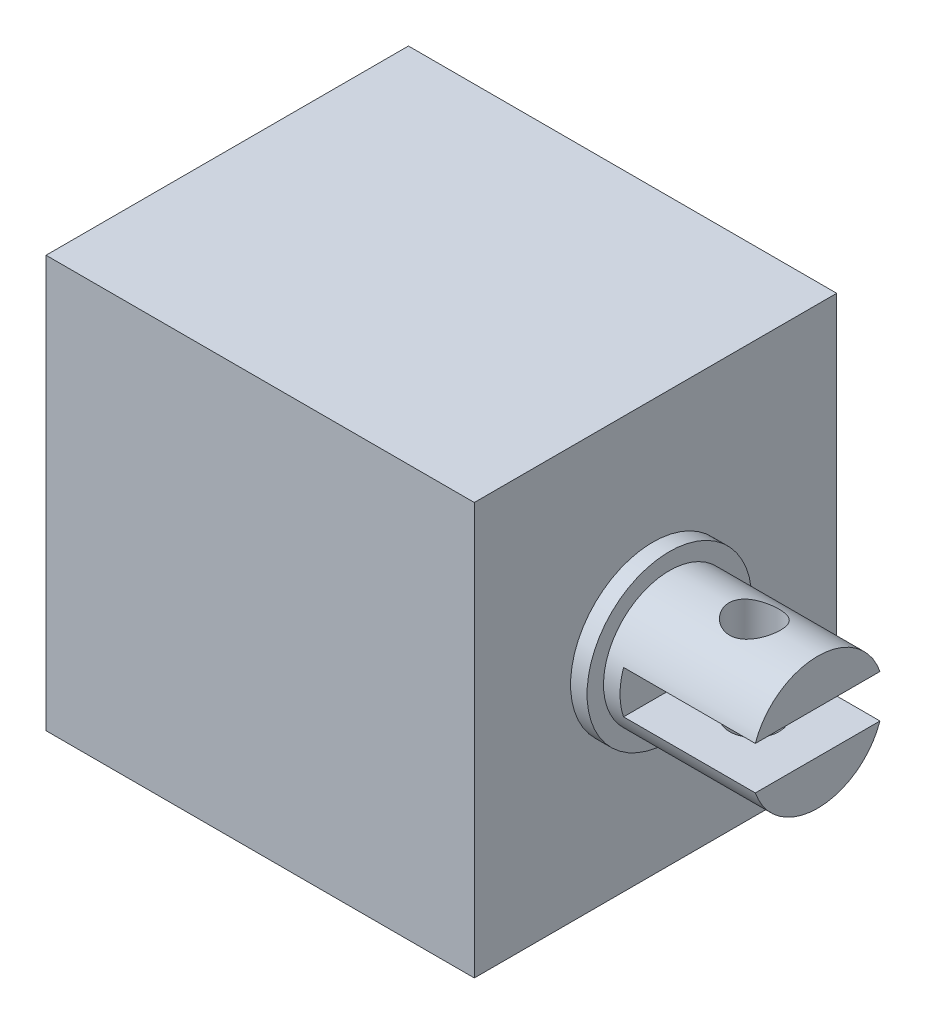
ISO-10303-21;
HEADER;
FILE_DESCRIPTION(('STEP AP214'),'2;1');
FILE_NAME('part.step','',(''),(''),'','','');
FILE_SCHEMA(('AUTOMOTIVE_DESIGN { 1 0 10303 214 1 1 1 1 }'));
ENDSEC;
DATA;
#1=APPLICATION_CONTEXT('core data for automotive mechanical design processes');
#2=APPLICATION_PROTOCOL_DEFINITION('international standard','automotive_design',2000,#1);
#3=PRODUCT_CONTEXT('',#1,'mechanical');
#4=PRODUCT('Part','Part','',(#3));
#5=PRODUCT_RELATED_PRODUCT_CATEGORY('part','',(#4));
#6=PRODUCT_DEFINITION_FORMATION('','',#4);
#7=PRODUCT_DEFINITION_CONTEXT('part definition',#1,'design');
#8=PRODUCT_DEFINITION('design','',#6,#7);
#9=PRODUCT_DEFINITION_SHAPE('','',#8);
#10=(LENGTH_UNIT() NAMED_UNIT(*) SI_UNIT(.MILLI.,.METRE.));
#11=(NAMED_UNIT(*) PLANE_ANGLE_UNIT() SI_UNIT($,.RADIAN.));
#12=(NAMED_UNIT(*) SI_UNIT($,.STERADIAN.) SOLID_ANGLE_UNIT());
#13=UNCERTAINTY_MEASURE_WITH_UNIT(LENGTH_MEASURE(1.E-05),#10,'distance_accuracy_value','');
#14=(GEOMETRIC_REPRESENTATION_CONTEXT(3) GLOBAL_UNCERTAINTY_ASSIGNED_CONTEXT((#13)) GLOBAL_UNIT_ASSIGNED_CONTEXT((#10,
#11,#12)) REPRESENTATION_CONTEXT('',''));
#15=CARTESIAN_POINT('',(0.,0.,0.));
#16=DIRECTION('',(0.,0.,1.));
#17=DIRECTION('',(1.,0.,0.));
#18=AXIS2_PLACEMENT_3D('',#15,#16,#17);
#19=CARTESIAN_POINT('',(23.,0.,11.1565395397867));
#20=DIRECTION('',(-1.,0.,0.));
#21=DIRECTION('',(0.,0.,1.));
#22=AXIS2_PLACEMENT_3D('',#19,#20,#21);
#23=CYLINDRICAL_SURFACE('',#22,4.);
#24=CARTESIAN_POINT('',(19.,-3.76764037453728,12.5));
#25=CARTESIAN_POINT('',(19.0817774124885,-3.76763790492412,12.5000027155273));
#26=CARTESIAN_POINT('',(19.1635358667912,-3.77005217106359,12.4932918328822));
#27=CARTESIAN_POINT('',(19.3246120732598,-3.77936567915541,12.4667270165369));
#28=CARTESIAN_POINT('',(19.4039300190837,-3.78626456428046,12.4468741285032));
#29=CARTESIAN_POINT('',(19.5577828755653,-3.80361094583546,12.3947993778484));
#30=CARTESIAN_POINT('',(19.632326778774,-3.81405152242035,12.3626016190853));
#31=CARTESIAN_POINT('',(19.7750014908431,-3.83719088593268,12.2868185332426));
#32=CARTESIAN_POINT('',(19.8431304906321,-3.84989030697869,12.243230006851));
#33=CARTESIAN_POINT('',(19.9737884338616,-3.87655433221961,12.1439889506233));
#34=CARTESIAN_POINT('',(20.0360194969036,-3.89054828259262,12.087951882686));
#35=CARTESIAN_POINT('',(20.1504044942059,-3.91769459717879,11.9662024764727));
#36=CARTESIAN_POINT('',(20.2025571357725,-3.93084685328877,11.9004888989556));
#37=CARTESIAN_POINT('',(20.296310355649,-3.95494757884398,11.7595303942377));
#38=CARTESIAN_POINT('',(20.337673188727,-3.96584544916804,11.6841179542089));
#39=CARTESIAN_POINT('',(20.4070221627787,-3.98359756820293,11.5269342463372));
#40=CARTESIAN_POINT('',(20.4350132671091,-3.99045331750149,11.4451653510259));
#41=CARTESIAN_POINT('',(20.4756417507864,-3.99884743629862,11.2815411166472));
#42=CARTESIAN_POINT('',(20.4889123036747,-4.0006108160496,11.1998546340827));
#43=CARTESIAN_POINT('',(20.5018437601809,-3.99901132562989,11.0354710301895));
#44=CARTESIAN_POINT('',(20.5015079756362,-3.99564970309709,10.9527741596923));
#45=CARTESIAN_POINT('',(20.487628463041,-3.98414905340773,10.7921311588542));
#46=CARTESIAN_POINT('',(20.4746009890775,-3.97620169932968,10.7141256131429));
#47=CARTESIAN_POINT('',(20.4366605427489,-3.95625833962157,10.5616118004772));
#48=CARTESIAN_POINT('',(20.4117461390219,-3.94426184646622,10.4871039558848));
#49=CARTESIAN_POINT('',(20.3500727010366,-3.91678730172505,10.3414178158428));
#50=CARTESIAN_POINT('',(20.3130118439396,-3.90122394481279,10.2703838608162));
#51=CARTESIAN_POINT('',(20.2283499464764,-3.86809253769863,10.1354140647516));
#52=CARTESIAN_POINT('',(20.1807449621367,-3.85052373856685,10.0714808931937));
#53=CARTESIAN_POINT('',(20.0727397234559,-3.8136882419719,9.94815730890556));
#54=CARTESIAN_POINT('',(20.0117122033629,-3.79438512232671,9.88932591952672));
#55=CARTESIAN_POINT('',(19.8803773233429,-3.75705397938726,9.78258533137712));
#56=CARTESIAN_POINT('',(19.8100676025481,-3.73902628228614,9.73467891978681));
#57=CARTESIAN_POINT('',(19.660580218023,-3.70593880202671,9.65051771180466));
#58=CARTESIAN_POINT('',(19.5812799857175,-3.69093041617302,9.61445898454337));
#59=CARTESIAN_POINT('',(19.416911377607,-3.66616987767466,9.55647508810593));
#60=CARTESIAN_POINT('',(19.3318473978472,-3.65641376877903,9.53453927846676));
#61=CARTESIAN_POINT('',(19.1649396133064,-3.64401063658038,9.50687284562214));
#62=CARTESIAN_POINT('',(19.0833045178836,-3.64090259375618,9.50008975654236));
#63=CARTESIAN_POINT('',(18.920028231081,-3.64082242677834,9.49991209423228));
#64=CARTESIAN_POINT('',(18.838387047569,-3.6438486133491,9.50651383501888));
#65=CARTESIAN_POINT('',(18.6821942874693,-3.65529315257469,9.53203759857448));
#66=CARTESIAN_POINT('',(18.6075015155483,-3.6634006254614,9.55025028514564));
#67=CARTESIAN_POINT('',(18.4622809303234,-3.68380266945073,9.59761099041495));
#68=CARTESIAN_POINT('',(18.391754058018,-3.69609818234102,9.62676146890466));
#69=CARTESIAN_POINT('',(18.2532476081843,-3.72428185070434,9.69667506604072));
#70=CARTESIAN_POINT('',(18.1855371493079,-3.74030998536923,9.73791335165038));
#71=CARTESIAN_POINT('',(18.0576866389821,-3.77404571851193,9.83026894419388));
#72=CARTESIAN_POINT('',(17.9975497884841,-3.79175402159823,9.88139040522111));
#73=CARTESIAN_POINT('',(17.8815942006363,-3.82870627106685,9.99681593421965));
#74=CARTESIAN_POINT('',(17.8264971025024,-3.84796053960215,10.0618442876624));
#75=CARTESIAN_POINT('',(17.7279007893444,-3.88476077966972,10.2006200066427));
#76=CARTESIAN_POINT('',(17.6844027094545,-3.90230658389709,10.2743682245283));
#77=CARTESIAN_POINT('',(17.6101256757362,-3.93413789072419,10.4293202376786));
#78=CARTESIAN_POINT('',(17.5794326038522,-3.94840110028474,10.5105700472421));
#79=CARTESIAN_POINT('',(17.5324466009346,-3.9721423585089,10.6777906967834));
#80=CARTESIAN_POINT('',(17.5161463372029,-3.98162284276903,10.7637591090362));
#81=CARTESIAN_POINT('',(17.4992903356975,-3.99454494286451,10.9322495384738));
#82=CARTESIAN_POINT('',(17.4978210375977,-3.99832454609011,11.014654739123));
#83=CARTESIAN_POINT('',(17.5084137915925,-4.0007789164222,11.1786587455474));
#84=CARTESIAN_POINT('',(17.5204732226663,-3.99945467221374,11.2602577044323));
#85=CARTESIAN_POINT('',(17.5570287985856,-3.99224107319566,11.4172481064788));
#86=CARTESIAN_POINT('',(17.5810567053771,-3.98651949012689,11.4927573790093));
#87=CARTESIAN_POINT('',(17.6405131813888,-3.97150556075485,11.6387575818455));
#88=CARTESIAN_POINT('',(17.6759434339888,-3.9622126871665,11.7092477692831));
#89=CARTESIAN_POINT('',(17.7584848583022,-3.94081069940884,11.8456953734951));
#90=CARTESIAN_POINT('',(17.8059333886453,-3.92862101689076,11.9114357039414));
#91=CARTESIAN_POINT('',(17.910635085886,-3.90300639028028,12.0343136301446));
#92=CARTESIAN_POINT('',(17.9678912328597,-3.88958107131113,12.0914486011895));
#93=CARTESIAN_POINT('',(18.0939999792521,-3.86232792605645,12.1984751399335));
#94=CARTESIAN_POINT('',(18.163293351656,-3.84851420382147,12.2478525814991));
#95=CARTESIAN_POINT('',(18.3095250001694,-3.82293454805591,12.3343395519271));
#96=CARTESIAN_POINT('',(18.3864647459792,-3.81116900940473,12.37144671638));
#97=CARTESIAN_POINT('',(18.5508729143159,-3.79066578627342,12.4340434655919));
#98=CARTESIAN_POINT('',(18.6386975873322,-3.78215775094606,12.4586820686995));
#99=CARTESIAN_POINT('',(18.8176905428281,-3.77064786525332,12.4916545467819));
#100=CARTESIAN_POINT('',(18.9088570460164,-3.76764312698237,12.4999969734775));
#101=CARTESIAN_POINT('',(19.,-3.76764037453728,12.5));
#102=B_SPLINE_CURVE_WITH_KNOTS('',3,(#24,#25,#26,#27,#28,#29,#30,#31,#32,#33,#34,#35,#36,#37,
#38,#39,#40,#41,#42,#43,#44,#45,#46,#47,#48,#49,#50,#51,#52,#53,#54,#55,#56,#57,#58,#59,#60,#61,
#62,#63,#64,#65,#66,#67,#68,#69,#70,#71,#72,#73,#74,#75,#76,#77,#78,#79,#80,#81,#82,#83,#84,#85,
#86,#87,#88,#89,#90,#91,#92,#93,#94,#95,#96,#97,#98,#99,#100,#101),.UNSPECIFIED.,.T.,.F.,(4,2,2,
2,2,2,2,2,2,2,2,2,2,2,2,2,2,2,2,2,2,2,2,2,2,2,2,2,2,2,2,2,2,2,2,2,2,2,4),(0.,0.244996485779091,
0.489973480328818,0.734474563490945,0.979044393343505,1.23260368275923,1.48619547302578,
1.74497611746958,2.00366063219206,2.25072574683233,2.49773072519102,2.73509068446068,
2.97247923259428,3.21628135087578,3.46017481647847,3.71980012435093,3.97949159392015,
4.24328646986704,4.50688236465639,4.75151132143853,4.99607292019431,5.22696346472374,
5.45790596520068,5.69954087837873,5.94127757715752,6.20220218456115,6.46315231790473,
6.72582552570373,6.98836483214704,7.23462559332335,7.48083865281988,7.71809763059171,
7.95539165205671,8.20027529608438,8.44523348122264,8.70261143551749,8.96003895615255,
9.23323701883062,9.50629167720154),.UNSPECIFIED.);
#103=CARTESIAN_POINT('',(19.,-3.76764037453728,12.5));
#104=VERTEX_POINT('',#103);
#105=EDGE_CURVE('E136',#104,#104,#102,.T.);
#106=ORIENTED_EDGE('',*,*,#105,.T.);
#107=EDGE_LOOP('',(#106));
#108=FACE_BOUND('',#107,.T.);
#109=CARTESIAN_POINT('',(14.,0.,11.1565395397867));
#110=DIRECTION('',(1.,0.,0.));
#111=DIRECTION('',(0.,0.,-1.));
#112=AXIS2_PLACEMENT_3D('',#109,#110,#111);
#113=CIRCLE('',#112,4.);
#114=CARTESIAN_POINT('',(14.,0.,7.15653953978667));
#115=VERTEX_POINT('',#114);
#116=EDGE_CURVE('E152',#115,#115,#113,.T.);
#117=ORIENTED_EDGE('',*,*,#116,.T.);
#118=EDGE_LOOP('',(#117));
#119=FACE_BOUND('',#118,.T.);
#120=DIRECTION('',(-1.,0.,0.));
#121=VECTOR('',#120,1.);
#122=CARTESIAN_POINT('',(23.,1.30000000000001,14.9393956036622));
#123=LINE('',#122,#121);
#124=CARTESIAN_POINT('',(23.,1.30000000000001,14.9393956036622));
#125=VERTEX_POINT('',#124);
#126=CARTESIAN_POINT('',(15.,1.3,14.9393956036622));
#127=VERTEX_POINT('',#126);
#128=EDGE_CURVE('E256',#125,#127,#123,.T.);
#129=ORIENTED_EDGE('',*,*,#128,.F.);
#130=CARTESIAN_POINT('',(23.,0.,11.1565395397867));
#131=DIRECTION('',(1.,0.,0.));
#132=DIRECTION('',(0.,0.,-1.));
#133=AXIS2_PLACEMENT_3D('',#130,#131,#132);
#134=CIRCLE('',#133,4.);
#135=CARTESIAN_POINT('',(23.,1.30000000000001,7.37368347591113));
#136=VERTEX_POINT('',#135);
#137=EDGE_CURVE('E142',#136,#125,#134,.T.);
#138=ORIENTED_EDGE('',*,*,#137,.F.);
#139=DIRECTION('',(-1.,0.,0.));
#140=VECTOR('',#139,1.);
#141=CARTESIAN_POINT('',(23.,1.30000000000001,7.37368347591113));
#142=LINE('',#141,#140);
#143=CARTESIAN_POINT('',(15.,1.3,7.37368347591113));
#144=VERTEX_POINT('',#143);
#145=EDGE_CURVE('E148',#136,#144,#142,.T.);
#146=ORIENTED_EDGE('',*,*,#145,.T.);
#147=CARTESIAN_POINT('',(15.,0.,11.1565395397867));
#148=DIRECTION('',(-1.,0.,0.));
#149=DIRECTION('',(0.,0.,1.));
#150=AXIS2_PLACEMENT_3D('',#147,#148,#149);
#151=CIRCLE('',#150,4.);
#152=CARTESIAN_POINT('',(15.,-1.3,7.37368347591112));
#153=VERTEX_POINT('',#152);
#154=EDGE_CURVE('E11',#144,#153,#151,.T.);
#155=ORIENTED_EDGE('',*,*,#154,.T.);
#156=DIRECTION('',(-1.,0.,0.));
#157=VECTOR('',#156,1.);
#158=CARTESIAN_POINT('',(23.,-1.3,7.37368347591112));
#159=LINE('',#158,#157);
#160=CARTESIAN_POINT('',(23.,-1.3,7.37368347591112));
#161=VERTEX_POINT('',#160);
#162=EDGE_CURVE('E140',#153,#161,#159,.F.);
#163=ORIENTED_EDGE('',*,*,#162,.T.);
#164=CARTESIAN_POINT('',(23.,-1.3,14.9393956036622));
#165=VERTEX_POINT('',#164);
#166=EDGE_CURVE('E120',#165,#161,#134,.T.);
#167=ORIENTED_EDGE('',*,*,#166,.F.);
#168=DIRECTION('',(-1.,0.,0.));
#169=VECTOR('',#168,1.);
#170=CARTESIAN_POINT('',(23.,-1.3,14.9393956036622));
#171=LINE('',#170,#169);
#172=CARTESIAN_POINT('',(15.,-1.3,14.9393956036622));
#173=VERTEX_POINT('',#172);
#174=EDGE_CURVE('E127',#173,#165,#171,.F.);
#175=ORIENTED_EDGE('',*,*,#174,.F.);
#176=CARTESIAN_POINT('',(15.,0.,11.1565395397867));
#177=DIRECTION('',(1.,0.,0.));
#178=DIRECTION('',(0.,0.,-1.));
#179=AXIS2_PLACEMENT_3D('',#176,#177,#178);
#180=CIRCLE('',#179,4.);
#181=EDGE_CURVE('E135',#127,#173,#180,.T.);
#182=ORIENTED_EDGE('',*,*,#181,.F.);
#183=EDGE_LOOP('',(#129,#138,#146,#155,#163,#167,#175,#182));
#184=FACE_BOUND('',#183,.T.);
#185=CARTESIAN_POINT('',(19.,3.64086208927547,9.5));
#186=CARTESIAN_POINT('',(18.9198702749074,3.64085880086429,9.49999657848875));
#187=CARTESIAN_POINT('',(18.8397618350171,3.64381415497308,9.50644387030782));
#188=CARTESIAN_POINT('',(18.6819875354446,3.6552442651418,9.53192206463687));
#189=CARTESIAN_POINT('',(18.6043217512359,3.66371919157126,9.55095335557037));
#190=CARTESIAN_POINT('',(18.4537875987825,3.68513446296981,9.60074153017101));
#191=CARTESIAN_POINT('',(18.380906069439,3.69806188893199,9.63146451693394));
#192=CARTESIAN_POINT('',(18.2413283573874,3.72700123239183,9.70362234597092));
#193=CARTESIAN_POINT('',(18.17463413679,3.74301412342807,9.74506057057574));
#194=CARTESIAN_POINT('',(18.0453300415292,3.77751915802119,9.84009151187496));
#195=CARTESIAN_POINT('',(17.9831390578497,3.79609874141371,9.89422235053184));
#196=CARTESIAN_POINT('',(17.8684178410114,3.83323349112447,10.0119313698175));
#197=CARTESIAN_POINT('',(17.815890506015,3.85178864846618,10.0755123742822));
#198=CARTESIAN_POINT('',(17.7194174569518,3.88809063326926,10.2141339836494));
#199=CARTESIAN_POINT('',(17.6760295816265,3.90575114911292,10.2895876689646));
#200=CARTESIAN_POINT('',(17.6027517944675,3.93747676200367,10.4474914288775));
#201=CARTESIAN_POINT('',(17.5728578057978,3.95154294442951,10.5299393813796));
#202=CARTESIAN_POINT('',(17.5286966404323,3.97425932417859,10.6960932368701));
#203=CARTESIAN_POINT('',(17.5138579340324,3.98310180232548,10.7796202762068));
#204=CARTESIAN_POINT('',(17.4985001581662,3.99547307161514,10.9483579660704));
#205=CARTESIAN_POINT('',(17.4979751775161,3.9990040556929,11.033567907055));
#206=CARTESIAN_POINT('',(17.5109584894425,4.00058049446999,11.1978345296313));
#207=CARTESIAN_POINT('',(17.5236335794369,3.99893986710934,11.2769556424355));
#208=CARTESIAN_POINT('',(17.561331652412,3.9912608389578,11.4319676965127));
#209=CARTESIAN_POINT('',(17.5863548290035,3.9852223692106,11.5078585871174));
#210=CARTESIAN_POINT('',(17.6479807916808,3.96956911072429,11.6545099287741));
#211=CARTESIAN_POINT('',(17.6846021938638,3.9599485680752,11.7252619054377));
#212=CARTESIAN_POINT('',(17.7683485051607,3.93827683432351,11.859837416555));
#213=CARTESIAN_POINT('',(17.8154762838158,3.92622497925738,11.9236590510721));
#214=CARTESIAN_POINT('',(17.9217521133099,3.90036304546926,12.0460824223397));
#215=CARTESIAN_POINT('',(17.9813978168003,3.88649412506342,12.1042400973858));
#216=CARTESIAN_POINT('',(18.1095473577555,3.85918372856059,12.2099573173833));
#217=CARTESIAN_POINT('',(18.1780533762303,3.84574235872563,12.2575142450328));
#218=CARTESIAN_POINT('',(18.3242775499567,3.82058922509558,12.3419072960076));
#219=CARTESIAN_POINT('',(18.4021966723543,3.80893493750307,12.3784139992064));
#220=CARTESIAN_POINT('',(18.5635442066597,3.78941916475394,12.4376662688424));
#221=CARTESIAN_POINT('',(18.6469703965154,3.78155616035542,12.4604173483587));
#222=CARTESIAN_POINT('',(18.8133705439947,3.77099535587789,12.490646911885));
#223=CARTESIAN_POINT('',(18.8962264487423,3.76810160133518,12.4987056131184));
#224=CARTESIAN_POINT('',(19.06214455219,3.76728213657078,12.5010055442817));
#225=CARTESIAN_POINT('',(19.1452067017758,3.76935533925938,12.4952497977009));
#226=CARTESIAN_POINT('',(19.3057236574614,3.77799149526264,12.4706686450462));
#227=CARTESIAN_POINT('',(19.3832701978334,3.78437310882586,12.452370679346));
#228=CARTESIAN_POINT('',(19.5341695311664,3.80062239353263,12.4039038776115));
#229=CARTESIAN_POINT('',(19.6075215477283,3.81049070764736,12.3737328519877));
#230=CARTESIAN_POINT('',(19.7503975380214,3.83286883717044,12.3013487172675));
#231=CARTESIAN_POINT('',(19.8197413235391,3.84544884911875,12.258802333306));
#232=CARTESIAN_POINT('',(19.9505583199976,3.87157723481319,12.1631884128229));
#233=CARTESIAN_POINT('',(20.0120290842431,3.88512590756113,12.1101176186294));
#234=CARTESIAN_POINT('',(20.1284878648012,3.91230578283252,11.9918345303548));
#235=CARTESIAN_POINT('',(20.1830076106304,3.92590819738283,11.9261530524118));
#236=CARTESIAN_POINT('',(20.2802983082367,3.95076978698175,11.7861915246253));
#237=CARTESIAN_POINT('',(20.3230701768539,3.962029144873,11.7119121464316));
#238=CARTESIAN_POINT('',(20.3950598442302,3.98058720835622,11.5576429942668));
#239=CARTESIAN_POINT('',(20.4244302639787,3.9879306808946,11.4777301367934));
#240=CARTESIAN_POINT('',(20.4692618123918,3.9977482979035,11.3138165598599));
#241=CARTESIAN_POINT('',(20.484728849948,4.00022451147443,11.2298175929978));
#242=CARTESIAN_POINT('',(20.5007536819372,3.99975588845414,11.0649951548468));
#243=CARTESIAN_POINT('',(20.5020678582081,3.99709516078566,10.9842435443014));
#244=CARTESIAN_POINT('',(20.4917899176552,3.98695283656452,10.8238824917128));
#245=CARTESIAN_POINT('',(20.4801985126732,3.97947150591466,10.7442729869189));
#246=CARTESIAN_POINT('',(20.4448708619441,3.96035193502388,10.5894162143588));
#247=CARTESIAN_POINT('',(20.4212899565822,3.94876742559769,10.5141265313189));
#248=CARTESIAN_POINT('',(20.3629167709547,3.92233343180608,10.3686479317835));
#249=CARTESIAN_POINT('',(20.3281219347775,3.90748320335383,10.2984601826094));
#250=CARTESIAN_POINT('',(20.2462569417746,3.87486348140707,10.1612185270285));
#251=CARTESIAN_POINT('',(20.198644829536,3.85698270326697,10.0945146326944));
#252=CARTESIAN_POINT('',(20.0933400268479,3.82046105104669,9.96981870635294));
#253=CARTESIAN_POINT('',(20.0356431141058,3.80181986111423,9.91183034234251));
#254=CARTESIAN_POINT('',(19.9080231358486,3.7644809409667,9.80296048691097));
#255=CARTESIAN_POINT('',(19.8376050905486,3.74583550785485,9.75263862492829));
#256=CARTESIAN_POINT('',(19.688584590481,3.71164453376309,9.66458282133355));
#257=CARTESIAN_POINT('',(19.6099821957788,3.6960989700355,9.6268487873472));
#258=CARTESIAN_POINT('',(19.4446622847333,3.66974667860732,9.56464109129519));
#259=CARTESIAN_POINT('',(19.3577945118854,3.65906361167844,9.54051009040472));
#260=CARTESIAN_POINT('',(19.1806068934446,3.64462600406647,9.50819799748226));
#261=CARTESIAN_POINT('',(19.090289934115,3.64086579464734,9.50000385534862));
#262=CARTESIAN_POINT('',(19.,3.64086208927547,9.5));
#263=B_SPLINE_CURVE_WITH_KNOTS('',3,(#185,#186,#187,#188,#189,#190,#191,#192,#193,#194,#195,
#196,#197,#198,#199,#200,#201,#202,#203,#204,#205,#206,#207,#208,#209,#210,#211,#212,#213,#214,
#215,#216,#217,#218,#219,#220,#221,#222,#223,#224,#225,#226,#227,#228,#229,#230,#231,#232,#233,
#234,#235,#236,#237,#238,#239,#240,#241,#242,#243,#244,#245,#246,#247,#248,#249,#250,#251,#252,
#253,#254,#255,#256,#257,#258,#259,#260,#261,#262),.UNSPECIFIED.,.T.,.F.,(4,2,2,2,2,2,2,2,2,2,2,
2,2,2,2,2,2,2,2,2,2,2,2,2,2,2,2,2,2,2,2,2,2,2,2,2,2,2,4),(0.,0.240048807612206,
0.480105025027438,0.719470502341175,0.958911629270834,1.21136421008643,1.46389237933693,
1.72900018295212,1.99402783726303,2.24856866085748,2.50300436434365,2.74229966123905,
2.98159871026408,3.22128381715502,3.46103446812283,3.71325323103705,3.96553419741946,
4.22472702336098,4.48381589913155,4.73243107000282,4.98099183285486,5.21969386041409,
5.45843992923639,5.70432893113069,5.9502941633787,6.20837110305757,6.46642789589912,
6.72146761531258,6.97639889237287,7.21763347793051,7.45885475821091,7.6970274350888,
7.93525443541168,8.18580667074258,8.43646405937259,8.70078348799032,8.96510097688875,
9.23580902021496,9.50629529729449),.UNSPECIFIED.);
#264=CARTESIAN_POINT('',(19.,3.64086208927547,9.5));
#265=VERTEX_POINT('',#264);
#266=EDGE_CURVE('E200',#265,#265,#263,.T.);
#267=ORIENTED_EDGE('',*,*,#266,.F.);
#268=EDGE_LOOP('',(#267));
#269=FACE_BOUND('',#268,.T.);
#270=ADVANCED_FACE('F39',(#108,#119,#184,#269),#23,.T.);
#271=CARTESIAN_POINT('',(23.,0.,11.1565395397867));
#272=DIRECTION('',(1.,0.,0.));
#273=DIRECTION('',(0.,0.,-1.));
#274=AXIS2_PLACEMENT_3D('',#271,#272,#273);
#275=PLANE('',#274);
#276=ORIENTED_EDGE('',*,*,#137,.T.);
#277=DIRECTION('',(0.,0.,1.));
#278=VECTOR('',#277,1.);
#279=CARTESIAN_POINT('',(23.,1.30000000000001,11.1565395397867));
#280=LINE('',#279,#278);
#281=EDGE_CURVE('E124',#136,#125,#280,.T.);
#282=ORIENTED_EDGE('',*,*,#281,.F.);
#283=EDGE_LOOP('',(#276,#282));
#284=FACE_BOUND('',#283,.T.);
#285=ADVANCED_FACE('F244',(#284),#275,.T.);
#286=DIRECTION('',(0.,0.,-1.));
#287=VECTOR('',#286,1.);
#288=CARTESIAN_POINT('',(23.,-1.3,11.1565395397867));
#289=LINE('',#288,#287);
#290=EDGE_CURVE('E50',#165,#161,#289,.T.);
#291=ORIENTED_EDGE('',*,*,#290,.F.);
#292=ORIENTED_EDGE('',*,*,#166,.T.);
#293=EDGE_LOOP('',(#291,#292));
#294=FACE_BOUND('',#293,.T.);
#295=ADVANCED_FACE('F118',(#294),#275,.T.);
#296=CARTESIAN_POINT('',(-13.,-12.5,22.));
#297=DIRECTION('',(1.,0.,0.));
#298=DIRECTION('',(0.,0.,-1.));
#299=AXIS2_PLACEMENT_3D('',#296,#297,#298);
#300=PLANE('',#299);
#301=DIRECTION('',(0.,-1.,0.));
#302=VECTOR('',#301,1.);
#303=CARTESIAN_POINT('',(-13.,-12.5,0.));
#304=LINE('',#303,#302);
#305=CARTESIAN_POINT('',(-13.,12.5,0.));
#306=VERTEX_POINT('',#305);
#307=CARTESIAN_POINT('',(-13.,-12.5,0.));
#308=VERTEX_POINT('',#307);
#309=EDGE_CURVE('E160',#306,#308,#304,.T.);
#310=ORIENTED_EDGE('',*,*,#309,.T.);
#311=DIRECTION('',(0.,0.,-1.));
#312=VECTOR('',#311,1.);
#313=CARTESIAN_POINT('',(-13.,-12.5,22.));
#314=LINE('',#313,#312);
#315=CARTESIAN_POINT('',(-13.,-12.5,22.));
#316=VERTEX_POINT('',#315);
#317=EDGE_CURVE('E164',#316,#308,#314,.T.);
#318=ORIENTED_EDGE('',*,*,#317,.F.);
#319=DIRECTION('',(0.,-1.,0.));
#320=VECTOR('',#319,1.);
#321=CARTESIAN_POINT('',(-13.,-12.5,22.));
#322=LINE('',#321,#320);
#323=CARTESIAN_POINT('',(-13.,12.5,22.));
#324=VERTEX_POINT('',#323);
#325=EDGE_CURVE('E165',#324,#316,#322,.T.);
#326=ORIENTED_EDGE('',*,*,#325,.F.);
#327=DIRECTION('',(0.,0.,-1.));
#328=VECTOR('',#327,1.);
#329=CARTESIAN_POINT('',(-13.,12.5,22.));
#330=LINE('',#329,#328);
#331=EDGE_CURVE('E175',#324,#306,#330,.T.);
#332=ORIENTED_EDGE('',*,*,#331,.T.);
#333=EDGE_LOOP('',(#310,#318,#326,#332));
#334=FACE_BOUND('',#333,.T.);
#335=ADVANCED_FACE('F41',(#334),#300,.F.);
#336=CARTESIAN_POINT('',(13.,-12.5,22.));
#337=DIRECTION('',(0.,1.,0.));
#338=DIRECTION('',(-1.,0.,0.));
#339=AXIS2_PLACEMENT_3D('',#336,#337,#338);
#340=PLANE('',#339);
#341=DIRECTION('',(1.,0.,0.));
#342=VECTOR('',#341,1.);
#343=CARTESIAN_POINT('',(13.,-12.5,0.));
#344=LINE('',#343,#342);
#345=CARTESIAN_POINT('',(13.,-12.5,0.));
#346=VERTEX_POINT('',#345);
#347=EDGE_CURVE('E179',#308,#346,#344,.T.);
#348=ORIENTED_EDGE('',*,*,#347,.T.);
#349=DIRECTION('',(0.,0.,-1.));
#350=VECTOR('',#349,1.);
#351=CARTESIAN_POINT('',(13.,-12.5,22.));
#352=LINE('',#351,#350);
#353=CARTESIAN_POINT('',(13.,-12.5,22.));
#354=VERTEX_POINT('',#353);
#355=EDGE_CURVE('E191',#354,#346,#352,.T.);
#356=ORIENTED_EDGE('',*,*,#355,.F.);
#357=DIRECTION('',(1.,0.,0.));
#358=VECTOR('',#357,1.);
#359=CARTESIAN_POINT('',(13.,-12.5,22.));
#360=LINE('',#359,#358);
#361=EDGE_CURVE('E91',#316,#354,#360,.T.);
#362=ORIENTED_EDGE('',*,*,#361,.F.);
#363=ORIENTED_EDGE('',*,*,#317,.T.);
#364=EDGE_LOOP('',(#348,#356,#362,#363));
#365=FACE_BOUND('',#364,.T.);
#366=ADVANCED_FACE('F289',(#365),#340,.F.);
#367=CARTESIAN_POINT('',(13.,-12.5,22.));
#368=DIRECTION('',(-1.,0.,0.));
#369=DIRECTION('',(0.,0.,1.));
#370=AXIS2_PLACEMENT_3D('',#367,#368,#369);
#371=PLANE('',#370);
#372=CARTESIAN_POINT('',(13.,0.,11.1565395397867));
#373=DIRECTION('',(1.,0.,0.));
#374=DIRECTION('',(0.,0.,-1.));
#375=AXIS2_PLACEMENT_3D('',#372,#373,#374);
#376=CIRCLE('',#375,5.);
#377=CARTESIAN_POINT('',(13.,0.,6.15653953978667));
#378=VERTEX_POINT('',#377);
#379=EDGE_CURVE('E156',#378,#378,#376,.T.);
#380=ORIENTED_EDGE('',*,*,#379,.F.);
#381=EDGE_LOOP('',(#380));
#382=FACE_BOUND('',#381,.T.);
#383=DIRECTION('',(0.,1.,0.));
#384=VECTOR('',#383,1.);
#385=CARTESIAN_POINT('',(13.,-12.5,0.));
#386=LINE('',#385,#384);
#387=CARTESIAN_POINT('',(13.,12.5,0.));
#388=VERTEX_POINT('',#387);
#389=EDGE_CURVE('E77',#346,#388,#386,.T.);
#390=ORIENTED_EDGE('',*,*,#389,.T.);
#391=DIRECTION('',(0.,0.,-1.));
#392=VECTOR('',#391,1.);
#393=CARTESIAN_POINT('',(13.,12.5,22.));
#394=LINE('',#393,#392);
#395=CARTESIAN_POINT('',(13.,12.5,22.));
#396=VERTEX_POINT('',#395);
#397=EDGE_CURVE('E188',#396,#388,#394,.T.);
#398=ORIENTED_EDGE('',*,*,#397,.F.);
#399=DIRECTION('',(0.,1.,0.));
#400=VECTOR('',#399,1.);
#401=CARTESIAN_POINT('',(13.,-12.5,22.));
#402=LINE('',#401,#400);
#403=EDGE_CURVE('E170',#354,#396,#402,.T.);
#404=ORIENTED_EDGE('',*,*,#403,.F.);
#405=ORIENTED_EDGE('',*,*,#355,.T.);
#406=EDGE_LOOP('',(#390,#398,#404,#405));
#407=FACE_BOUND('',#406,.T.);
#408=ADVANCED_FACE('F286',(#382,#407),#371,.F.);
#409=CARTESIAN_POINT('',(13.,12.5,22.));
#410=DIRECTION('',(0.,-1.,0.));
#411=DIRECTION('',(1.,0.,0.));
#412=AXIS2_PLACEMENT_3D('',#409,#410,#411);
#413=PLANE('',#412);
#414=DIRECTION('',(-1.,0.,0.));
#415=VECTOR('',#414,1.);
#416=CARTESIAN_POINT('',(13.,12.5,0.));
#417=LINE('',#416,#415);
#418=EDGE_CURVE('E83',#388,#306,#417,.T.);
#419=ORIENTED_EDGE('',*,*,#418,.T.);
#420=ORIENTED_EDGE('',*,*,#331,.F.);
#421=DIRECTION('',(-1.,0.,0.));
#422=VECTOR('',#421,1.);
#423=CARTESIAN_POINT('',(13.,12.5,22.));
#424=LINE('',#423,#422);
#425=EDGE_CURVE('E59',#396,#324,#424,.T.);
#426=ORIENTED_EDGE('',*,*,#425,.F.);
#427=ORIENTED_EDGE('',*,*,#397,.T.);
#428=EDGE_LOOP('',(#419,#420,#426,#427));
#429=FACE_BOUND('',#428,.T.);
#430=ADVANCED_FACE('F288',(#429),#413,.F.);
#431=CARTESIAN_POINT('',(0.,0.,22.));
#432=DIRECTION('',(0.,0.,1.));
#433=DIRECTION('',(1.,0.,0.));
#434=AXIS2_PLACEMENT_3D('',#431,#432,#433);
#435=PLANE('',#434);
#436=ORIENTED_EDGE('',*,*,#325,.T.);
#437=ORIENTED_EDGE('',*,*,#361,.T.);
#438=ORIENTED_EDGE('',*,*,#403,.T.);
#439=ORIENTED_EDGE('',*,*,#425,.T.);
#440=EDGE_LOOP('',(#436,#437,#438,#439));
#441=FACE_BOUND('',#440,.T.);
#442=ADVANCED_FACE('F295',(#441),#435,.T.);
#443=CARTESIAN_POINT('',(0.,0.,0.));
#444=DIRECTION('',(0.,0.,1.));
#445=DIRECTION('',(1.,0.,0.));
#446=AXIS2_PLACEMENT_3D('',#443,#444,#445);
#447=PLANE('',#446);
#448=ORIENTED_EDGE('',*,*,#309,.F.);
#449=ORIENTED_EDGE('',*,*,#418,.F.);
#450=ORIENTED_EDGE('',*,*,#389,.F.);
#451=ORIENTED_EDGE('',*,*,#347,.F.);
#452=EDGE_LOOP('',(#448,#449,#450,#451));
#453=FACE_BOUND('',#452,.T.);
#454=ADVANCED_FACE('F282',(#453),#447,.F.);
#455=CARTESIAN_POINT('',(14.,0.,11.1565395397867));
#456=DIRECTION('',(-1.,0.,0.));
#457=DIRECTION('',(0.,0.,1.));
#458=AXIS2_PLACEMENT_3D('',#455,#456,#457);
#459=CYLINDRICAL_SURFACE('',#458,5.);
#460=CARTESIAN_POINT('',(14.,0.,11.1565395397867));
#461=DIRECTION('',(1.,0.,0.));
#462=DIRECTION('',(0.,0.,-1.));
#463=AXIS2_PLACEMENT_3D('',#460,#461,#462);
#464=CIRCLE('',#463,5.);
#465=CARTESIAN_POINT('',(14.,0.,6.15653953978667));
#466=VERTEX_POINT('',#465);
#467=EDGE_CURVE('E147',#466,#466,#464,.T.);
#468=ORIENTED_EDGE('',*,*,#467,.F.);
#469=EDGE_LOOP('',(#468));
#470=FACE_BOUND('',#469,.T.);
#471=ORIENTED_EDGE('',*,*,#379,.T.);
#472=EDGE_LOOP('',(#471));
#473=FACE_BOUND('',#472,.T.);
#474=ADVANCED_FACE('F277',(#470,#473),#459,.T.);
#475=CARTESIAN_POINT('',(14.,0.,11.1565395397867));
#476=DIRECTION('',(1.,0.,0.));
#477=DIRECTION('',(0.,0.,-1.));
#478=AXIS2_PLACEMENT_3D('',#475,#476,#477);
#479=PLANE('',#478);
#480=ORIENTED_EDGE('',*,*,#116,.F.);
#481=EDGE_LOOP('',(#480));
#482=FACE_BOUND('',#481,.T.);
#483=ORIENTED_EDGE('',*,*,#467,.T.);
#484=EDGE_LOOP('',(#483));
#485=FACE_BOUND('',#484,.T.);
#486=ADVANCED_FACE('F240',(#482,#485),#479,.T.);
#487=CARTESIAN_POINT('',(15.,1.3,6.));
#488=DIRECTION('',(-1.,0.,0.));
#489=DIRECTION('',(0.,0.,1.));
#490=AXIS2_PLACEMENT_3D('',#487,#488,#489);
#491=PLANE('',#490);
#492=DIRECTION('',(0.,0.,1.));
#493=VECTOR('',#492,1.);
#494=CARTESIAN_POINT('',(15.,1.3,6.));
#495=LINE('',#494,#493);
#496=EDGE_CURVE('E260',#144,#127,#495,.T.);
#497=ORIENTED_EDGE('',*,*,#496,.T.);
#498=ORIENTED_EDGE('',*,*,#181,.T.);
#499=DIRECTION('',(0.,0.,1.));
#500=VECTOR('',#499,1.);
#501=CARTESIAN_POINT('',(15.,-1.3,6.));
#502=LINE('',#501,#500);
#503=EDGE_CURVE('E130',#153,#173,#502,.T.);
#504=ORIENTED_EDGE('',*,*,#503,.F.);
#505=ORIENTED_EDGE('',*,*,#154,.F.);
#506=EDGE_LOOP('',(#497,#498,#504,#505));
#507=FACE_BOUND('',#506,.T.);
#508=ADVANCED_FACE('F237',(#507),#491,.F.);
#509=CARTESIAN_POINT('',(23.,-1.3,6.));
#510=DIRECTION('',(0.,-1.,0.));
#511=DIRECTION('',(1.,0.,0.));
#512=AXIS2_PLACEMENT_3D('',#509,#510,#511);
#513=PLANE('',#512);
#514=CARTESIAN_POINT('',(19.,-1.3,11.));
#515=DIRECTION('',(0.,-1.,0.));
#516=DIRECTION('',(1.,0.,0.));
#517=AXIS2_PLACEMENT_3D('',#514,#515,#516);
#518=CIRCLE('',#517,1.5);
#519=CARTESIAN_POINT('',(20.5,-1.3,11.));
#520=VERTEX_POINT('',#519);
#521=EDGE_CURVE('E197',#520,#520,#518,.T.);
#522=ORIENTED_EDGE('',*,*,#521,.T.);
#523=EDGE_LOOP('',(#522));
#524=FACE_BOUND('',#523,.T.);
#525=ORIENTED_EDGE('',*,*,#503,.T.);
#526=ORIENTED_EDGE('',*,*,#174,.T.);
#527=ORIENTED_EDGE('',*,*,#290,.T.);
#528=ORIENTED_EDGE('',*,*,#162,.F.);
#529=EDGE_LOOP('',(#525,#526,#527,#528));
#530=FACE_BOUND('',#529,.T.);
#531=ADVANCED_FACE('F128',(#524,#530),#513,.F.);
#532=CARTESIAN_POINT('',(23.,1.30000000000001,6.));
#533=DIRECTION('',(0.,1.,0.));
#534=DIRECTION('',(-1.,0.,0.));
#535=AXIS2_PLACEMENT_3D('',#532,#533,#534);
#536=PLANE('',#535);
#537=CARTESIAN_POINT('',(19.,1.30000000000001,11.));
#538=DIRECTION('',(0.,1.,0.));
#539=DIRECTION('',(-1.,0.,0.));
#540=AXIS2_PLACEMENT_3D('',#537,#538,#539);
#541=CIRCLE('',#540,1.5);
#542=CARTESIAN_POINT('',(17.5,1.30000000000001,11.));
#543=VERTEX_POINT('',#542);
#544=EDGE_CURVE('E43',#543,#543,#541,.F.);
#545=ORIENTED_EDGE('',*,*,#544,.F.);
#546=EDGE_LOOP('',(#545));
#547=FACE_BOUND('',#546,.T.);
#548=ORIENTED_EDGE('',*,*,#281,.T.);
#549=ORIENTED_EDGE('',*,*,#128,.T.);
#550=ORIENTED_EDGE('',*,*,#496,.F.);
#551=ORIENTED_EDGE('',*,*,#145,.F.);
#552=EDGE_LOOP('',(#548,#549,#550,#551));
#553=FACE_BOUND('',#552,.T.);
#554=ADVANCED_FACE('F233',(#547,#553),#536,.F.);
#555=CARTESIAN_POINT('',(19.,-6.,11.));
#556=DIRECTION('',(0.,1.,0.));
#557=DIRECTION('',(0.,0.,1.));
#558=AXIS2_PLACEMENT_3D('',#555,#556,#557);
#559=CYLINDRICAL_SURFACE('',#558,1.5);
#560=ORIENTED_EDGE('',*,*,#521,.F.);
#561=EDGE_LOOP('',(#560));
#562=FACE_BOUND('',#561,.T.);
#563=ORIENTED_EDGE('',*,*,#105,.F.);
#564=EDGE_LOOP('',(#563));
#565=FACE_BOUND('',#564,.T.);
#566=ADVANCED_FACE('F228',(#562,#565),#559,.F.);
#567=CARTESIAN_POINT('',(19.,6.,11.));
#568=DIRECTION('',(0.,-1.,0.));
#569=DIRECTION('',(0.,0.,-1.));
#570=AXIS2_PLACEMENT_3D('',#567,#568,#569);
#571=CYLINDRICAL_SURFACE('',#570,1.5);
#572=ORIENTED_EDGE('',*,*,#544,.T.);
#573=EDGE_LOOP('',(#572));
#574=FACE_BOUND('',#573,.T.);
#575=ORIENTED_EDGE('',*,*,#266,.T.);
#576=EDGE_LOOP('',(#575));
#577=FACE_BOUND('',#576,.T.);
#578=ADVANCED_FACE('F225',(#574,#577),#571,.F.);
#579=CLOSED_SHELL('',(#270,#285,#295,#335,#366,#408,#430,#442,#454,#474,#486,#508,#531,#554,
#566,#578));
#580=MANIFOLD_SOLID_BREP('B2',#579);
#581=ADVANCED_BREP_SHAPE_REPRESENTATION('',(#18,#580),#14);
#582=SHAPE_DEFINITION_REPRESENTATION(#9,#581);
ENDSEC;
END-ISO-10303-21;
